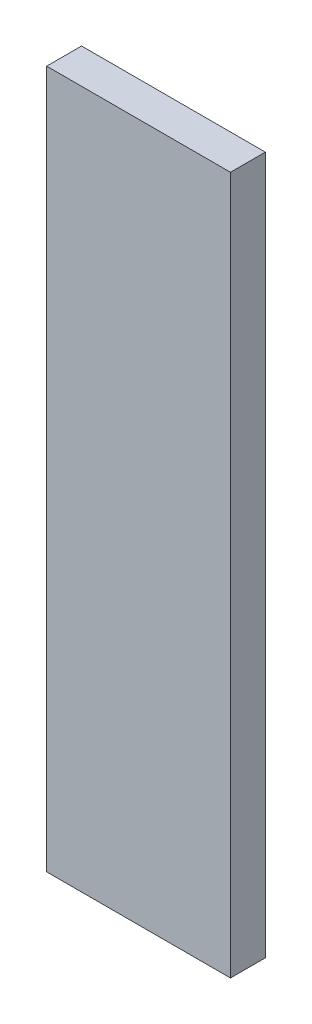
ISO-10303-21;
HEADER;
FILE_DESCRIPTION(('STEP AP214'),'2;1');
FILE_NAME('part.step','',(''),(''),'','','');
FILE_SCHEMA(('AUTOMOTIVE_DESIGN { 1 0 10303 214 1 1 1 1 }'));
ENDSEC;
DATA;
#1=APPLICATION_CONTEXT('core data for automotive mechanical design processes');
#2=APPLICATION_PROTOCOL_DEFINITION('international standard','automotive_design',2000,#1);
#3=PRODUCT_CONTEXT('',#1,'mechanical');
#4=PRODUCT('Part','Part','',(#3));
#5=PRODUCT_RELATED_PRODUCT_CATEGORY('part','',(#4));
#6=PRODUCT_DEFINITION_FORMATION('','',#4);
#7=PRODUCT_DEFINITION_CONTEXT('part definition',#1,'design');
#8=PRODUCT_DEFINITION('design','',#6,#7);
#9=PRODUCT_DEFINITION_SHAPE('','',#8);
#10=(LENGTH_UNIT() NAMED_UNIT(*) SI_UNIT(.MILLI.,.METRE.));
#11=(NAMED_UNIT(*) PLANE_ANGLE_UNIT() SI_UNIT($,.RADIAN.));
#12=(NAMED_UNIT(*) SI_UNIT($,.STERADIAN.) SOLID_ANGLE_UNIT());
#13=UNCERTAINTY_MEASURE_WITH_UNIT(LENGTH_MEASURE(1.E-05),#10,'distance_accuracy_value','');
#14=(GEOMETRIC_REPRESENTATION_CONTEXT(3) GLOBAL_UNCERTAINTY_ASSIGNED_CONTEXT((#13)) GLOBAL_UNIT_ASSIGNED_CONTEXT((#10,
#11,#12)) REPRESENTATION_CONTEXT('',''));
#15=CARTESIAN_POINT('',(0.,0.,0.));
#16=DIRECTION('',(0.,0.,1.));
#17=DIRECTION('',(1.,0.,0.));
#18=AXIS2_PLACEMENT_3D('',#15,#16,#17);
#19=CARTESIAN_POINT('',(16.7259,63.5,6.35));
#20=DIRECTION('',(-1.,0.,0.));
#21=DIRECTION('',(0.,-1.,0.));
#22=AXIS2_PLACEMENT_3D('',#19,#20,#21);
#23=PLANE('',#22);
#24=DIRECTION('',(0.,1.,0.));
#25=VECTOR('',#24,1.);
#26=CARTESIAN_POINT('',(16.7259,63.5,0.));
#27=LINE('',#26,#25);
#28=CARTESIAN_POINT('',(16.7259,-63.5,0.));
#29=VERTEX_POINT('',#28);
#30=CARTESIAN_POINT('',(16.7259,63.5,0.));
#31=VERTEX_POINT('',#30);
#32=EDGE_CURVE('E107',#29,#31,#27,.T.);
#33=ORIENTED_EDGE('',*,*,#32,.T.);
#34=DIRECTION('',(0.,0.,-1.));
#35=VECTOR('',#34,1.);
#36=CARTESIAN_POINT('',(16.7259,63.5,6.35));
#37=LINE('',#36,#35);
#38=CARTESIAN_POINT('',(16.7259,63.5,6.35));
#39=VERTEX_POINT('',#38);
#40=EDGE_CURVE('E11',#39,#31,#37,.T.);
#41=ORIENTED_EDGE('',*,*,#40,.F.);
#42=DIRECTION('',(0.,1.,0.));
#43=VECTOR('',#42,1.);
#44=CARTESIAN_POINT('',(16.7259,63.5,6.35));
#45=LINE('',#44,#43);
#46=CARTESIAN_POINT('',(16.7259,-63.5,6.35));
#47=VERTEX_POINT('',#46);
#48=EDGE_CURVE('E91',#47,#39,#45,.T.);
#49=ORIENTED_EDGE('',*,*,#48,.F.);
#50=DIRECTION('',(0.,0.,-1.));
#51=VECTOR('',#50,1.);
#52=CARTESIAN_POINT('',(16.7259,-63.5,6.35));
#53=LINE('',#52,#51);
#54=EDGE_CURVE('E103',#47,#29,#53,.T.);
#55=ORIENTED_EDGE('',*,*,#54,.T.);
#56=EDGE_LOOP('',(#33,#41,#49,#55));
#57=FACE_BOUND('',#56,.T.);
#58=ADVANCED_FACE('F39',(#57),#23,.F.);
#59=CARTESIAN_POINT('',(-16.7259,63.5,6.35));
#60=DIRECTION('',(0.,-1.,0.));
#61=DIRECTION('',(0.,0.,-1.));
#62=AXIS2_PLACEMENT_3D('',#59,#60,#61);
#63=PLANE('',#62);
#64=DIRECTION('',(-1.,0.,0.));
#65=VECTOR('',#64,1.);
#66=CARTESIAN_POINT('',(-16.7259,63.5,0.));
#67=LINE('',#66,#65);
#68=CARTESIAN_POINT('',(-16.7259,63.5,0.));
#69=VERTEX_POINT('',#68);
#70=EDGE_CURVE('E96',#31,#69,#67,.T.);
#71=ORIENTED_EDGE('',*,*,#70,.T.);
#72=DIRECTION('',(0.,0.,-1.));
#73=VECTOR('',#72,1.);
#74=CARTESIAN_POINT('',(-16.7259,63.5,6.35));
#75=LINE('',#74,#73);
#76=CARTESIAN_POINT('',(-16.7259,63.5,6.35));
#77=VERTEX_POINT('',#76);
#78=EDGE_CURVE('E48',#77,#69,#75,.T.);
#79=ORIENTED_EDGE('',*,*,#78,.F.);
#80=DIRECTION('',(-1.,0.,0.));
#81=VECTOR('',#80,1.);
#82=CARTESIAN_POINT('',(-16.7259,63.5,6.35));
#83=LINE('',#82,#81);
#84=EDGE_CURVE('E86',#39,#77,#83,.T.);
#85=ORIENTED_EDGE('',*,*,#84,.F.);
#86=ORIENTED_EDGE('',*,*,#40,.T.);
#87=EDGE_LOOP('',(#71,#79,#85,#86));
#88=FACE_BOUND('',#87,.T.);
#89=ADVANCED_FACE('F95',(#88),#63,.F.);
#90=CARTESIAN_POINT('',(-16.7259,63.5,6.35));
#91=DIRECTION('',(1.,0.,0.));
#92=DIRECTION('',(0.,1.,0.));
#93=AXIS2_PLACEMENT_3D('',#90,#91,#92);
#94=PLANE('',#93);
#95=DIRECTION('',(0.,-1.,0.));
#96=VECTOR('',#95,1.);
#97=CARTESIAN_POINT('',(-16.7259,63.5,0.));
#98=LINE('',#97,#96);
#99=CARTESIAN_POINT('',(-16.7259,-63.5,0.));
#100=VERTEX_POINT('',#99);
#101=EDGE_CURVE('E73',#69,#100,#98,.T.);
#102=ORIENTED_EDGE('',*,*,#101,.T.);
#103=DIRECTION('',(0.,0.,-1.));
#104=VECTOR('',#103,1.);
#105=CARTESIAN_POINT('',(-16.7259,-63.5,6.35));
#106=LINE('',#105,#104);
#107=CARTESIAN_POINT('',(-16.7259,-63.5,6.35));
#108=VERTEX_POINT('',#107);
#109=EDGE_CURVE('E98',#108,#100,#106,.T.);
#110=ORIENTED_EDGE('',*,*,#109,.F.);
#111=DIRECTION('',(0.,-1.,0.));
#112=VECTOR('',#111,1.);
#113=CARTESIAN_POINT('',(-16.7259,63.5,6.35));
#114=LINE('',#113,#112);
#115=EDGE_CURVE('E89',#77,#108,#114,.T.);
#116=ORIENTED_EDGE('',*,*,#115,.F.);
#117=ORIENTED_EDGE('',*,*,#78,.T.);
#118=EDGE_LOOP('',(#102,#110,#116,#117));
#119=FACE_BOUND('',#118,.T.);
#120=ADVANCED_FACE('F99',(#119),#94,.F.);
#121=CARTESIAN_POINT('',(-16.7259,-63.5,6.35));
#122=DIRECTION('',(0.,1.,0.));
#123=DIRECTION('',(0.,0.,1.));
#124=AXIS2_PLACEMENT_3D('',#121,#122,#123);
#125=PLANE('',#124);
#126=DIRECTION('',(1.,0.,0.));
#127=VECTOR('',#126,1.);
#128=CARTESIAN_POINT('',(-16.7259,-63.5,0.));
#129=LINE('',#128,#127);
#130=EDGE_CURVE('E79',#100,#29,#129,.T.);
#131=ORIENTED_EDGE('',*,*,#130,.T.);
#132=ORIENTED_EDGE('',*,*,#54,.F.);
#133=DIRECTION('',(1.,0.,0.));
#134=VECTOR('',#133,1.);
#135=CARTESIAN_POINT('',(-16.7259,-63.5,6.35));
#136=LINE('',#135,#134);
#137=EDGE_CURVE('E56',#108,#47,#136,.T.);
#138=ORIENTED_EDGE('',*,*,#137,.F.);
#139=ORIENTED_EDGE('',*,*,#109,.T.);
#140=EDGE_LOOP('',(#131,#132,#138,#139));
#141=FACE_BOUND('',#140,.T.);
#142=ADVANCED_FACE('F120',(#141),#125,.F.);
#143=CARTESIAN_POINT('',(0.,0.,6.35));
#144=DIRECTION('',(0.,0.,1.));
#145=DIRECTION('',(1.,0.,0.));
#146=AXIS2_PLACEMENT_3D('',#143,#144,#145);
#147=PLANE('',#146);
#148=ORIENTED_EDGE('',*,*,#48,.T.);
#149=ORIENTED_EDGE('',*,*,#84,.T.);
#150=ORIENTED_EDGE('',*,*,#115,.T.);
#151=ORIENTED_EDGE('',*,*,#137,.T.);
#152=EDGE_LOOP('',(#148,#149,#150,#151));
#153=FACE_BOUND('',#152,.T.);
#154=ADVANCED_FACE('F87',(#153),#147,.T.);
#155=CARTESIAN_POINT('',(0.,0.,0.));
#156=DIRECTION('',(0.,0.,1.));
#157=DIRECTION('',(1.,0.,0.));
#158=AXIS2_PLACEMENT_3D('',#155,#156,#157);
#159=PLANE('',#158);
#160=ORIENTED_EDGE('',*,*,#32,.F.);
#161=ORIENTED_EDGE('',*,*,#130,.F.);
#162=ORIENTED_EDGE('',*,*,#101,.F.);
#163=ORIENTED_EDGE('',*,*,#70,.F.);
#164=EDGE_LOOP('',(#160,#161,#162,#163));
#165=FACE_BOUND('',#164,.T.);
#166=ADVANCED_FACE('F123',(#165),#159,.F.);
#167=CLOSED_SHELL('',(#58,#89,#120,#142,#154,#166));
#168=MANIFOLD_SOLID_BREP('B2',#167);
#169=ADVANCED_BREP_SHAPE_REPRESENTATION('',(#18,#168),#14);
#170=SHAPE_DEFINITION_REPRESENTATION(#9,#169);
ENDSEC;
END-ISO-10303-21;
